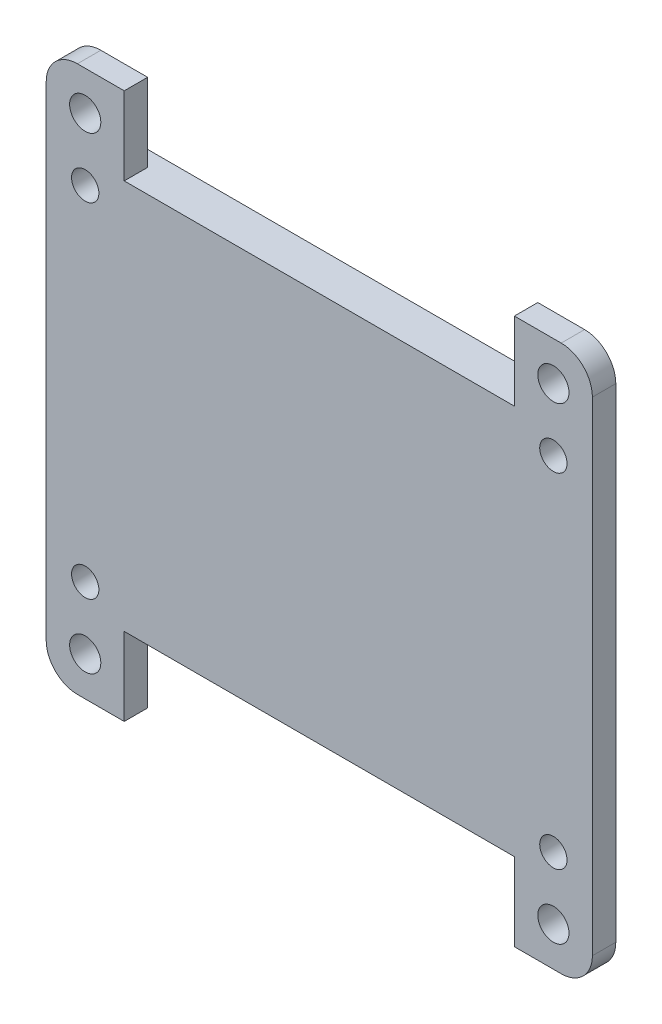
ISO-10303-21;
HEADER;
FILE_DESCRIPTION(('STEP AP214'),'2;1');
FILE_NAME('part.step','',(''),(''),'','','');
FILE_SCHEMA(('AUTOMOTIVE_DESIGN { 1 0 10303 214 1 1 1 1 }'));
ENDSEC;
DATA;
#1=APPLICATION_CONTEXT('core data for automotive mechanical design processes');
#2=APPLICATION_PROTOCOL_DEFINITION('international standard','automotive_design',2000,#1);
#3=PRODUCT_CONTEXT('',#1,'mechanical');
#4=PRODUCT('Part','Part','',(#3));
#5=PRODUCT_RELATED_PRODUCT_CATEGORY('part','',(#4));
#6=PRODUCT_DEFINITION_FORMATION('','',#4);
#7=PRODUCT_DEFINITION_CONTEXT('part definition',#1,'design');
#8=PRODUCT_DEFINITION('design','',#6,#7);
#9=PRODUCT_DEFINITION_SHAPE('','',#8);
#10=(LENGTH_UNIT() NAMED_UNIT(*) SI_UNIT(.MILLI.,.METRE.));
#11=(NAMED_UNIT(*) PLANE_ANGLE_UNIT() SI_UNIT($,.RADIAN.));
#12=(NAMED_UNIT(*) SI_UNIT($,.STERADIAN.) SOLID_ANGLE_UNIT());
#13=UNCERTAINTY_MEASURE_WITH_UNIT(LENGTH_MEASURE(1.E-05),#10,'distance_accuracy_value','');
#14=(GEOMETRIC_REPRESENTATION_CONTEXT(3) GLOBAL_UNCERTAINTY_ASSIGNED_CONTEXT((#13)) GLOBAL_UNIT_ASSIGNED_CONTEXT((#10,
#11,#12)) REPRESENTATION_CONTEXT('',''));
#15=CARTESIAN_POINT('',(0.,0.,0.));
#16=DIRECTION('',(0.,0.,1.));
#17=DIRECTION('',(1.,0.,0.));
#18=AXIS2_PLACEMENT_3D('',#15,#16,#17);
#19=CARTESIAN_POINT('',(0.,0.,0.));
#20=DIRECTION('',(0.,0.,-1.));
#21=DIRECTION('',(-1.,0.,0.));
#22=AXIS2_PLACEMENT_3D('',#19,#20,#21);
#23=PLANE('',#22);
#24=CARTESIAN_POINT('',(30.,-22.,0.));
#25=DIRECTION('',(0.,0.,1.));
#26=DIRECTION('',(-1.,0.,0.));
#27=AXIS2_PLACEMENT_3D('',#24,#25,#26);
#28=CIRCLE('',#27,1.75);
#29=CARTESIAN_POINT('',(28.25,-22.,0.));
#30=VERTEX_POINT('',#29);
#31=EDGE_CURVE('E376',#30,#30,#28,.T.);
#32=ORIENTED_EDGE('',*,*,#31,.T.);
#33=EDGE_LOOP('',(#32));
#34=FACE_BOUND('',#33,.T.);
#35=CARTESIAN_POINT('',(-30.,22.,0.));
#36=DIRECTION('',(0.,0.,1.));
#37=DIRECTION('',(1.,0.,0.));
#38=AXIS2_PLACEMENT_3D('',#35,#36,#37);
#39=CIRCLE('',#38,1.75);
#40=CARTESIAN_POINT('',(-28.25,22.,0.));
#41=VERTEX_POINT('',#40);
#42=EDGE_CURVE('E384',#41,#41,#39,.T.);
#43=ORIENTED_EDGE('',*,*,#42,.T.);
#44=EDGE_LOOP('',(#43));
#45=FACE_BOUND('',#44,.T.);
#46=DIRECTION('',(1.,0.,0.));
#47=VECTOR('',#46,1.);
#48=CARTESIAN_POINT('',(-33.,-25.,0.));
#49=LINE('',#48,#47);
#50=CARTESIAN_POINT('',(-30.,-25.,0.));
#51=VERTEX_POINT('',#50);
#52=CARTESIAN_POINT('',(30.,-25.,0.));
#53=VERTEX_POINT('',#52);
#54=EDGE_CURVE('E394',#51,#53,#49,.T.);
#55=ORIENTED_EDGE('',*,*,#54,.F.);
#56=CARTESIAN_POINT('',(-30.,-22.,0.));
#57=DIRECTION('',(0.,0.,-1.));
#58=DIRECTION('',(-1.,0.,0.));
#59=AXIS2_PLACEMENT_3D('',#56,#57,#58);
#60=CIRCLE('',#59,3.);
#61=CARTESIAN_POINT('',(-33.,-22.,0.));
#62=VERTEX_POINT('',#61);
#63=EDGE_CURVE('E436',#51,#62,#60,.T.);
#64=ORIENTED_EDGE('',*,*,#63,.T.);
#65=DIRECTION('',(0.,-1.,0.));
#66=VECTOR('',#65,1.);
#67=CARTESIAN_POINT('',(-33.,-25.,0.));
#68=LINE('',#67,#66);
#69=CARTESIAN_POINT('',(-33.,22.,0.));
#70=VERTEX_POINT('',#69);
#71=EDGE_CURVE('E414',#70,#62,#68,.T.);
#72=ORIENTED_EDGE('',*,*,#71,.F.);
#73=CARTESIAN_POINT('',(-30.,22.,0.));
#74=DIRECTION('',(0.,0.,-1.));
#75=DIRECTION('',(-1.,0.,0.));
#76=AXIS2_PLACEMENT_3D('',#73,#74,#75);
#77=CIRCLE('',#76,3.);
#78=CARTESIAN_POINT('',(-30.,25.,0.));
#79=VERTEX_POINT('',#78);
#80=EDGE_CURVE('E427',#70,#79,#77,.T.);
#81=ORIENTED_EDGE('',*,*,#80,.T.);
#82=DIRECTION('',(-1.,0.,0.));
#83=VECTOR('',#82,1.);
#84=CARTESIAN_POINT('',(-33.,25.,0.));
#85=LINE('',#84,#83);
#86=CARTESIAN_POINT('',(30.,25.,0.));
#87=VERTEX_POINT('',#86);
#88=EDGE_CURVE('E410',#87,#79,#85,.T.);
#89=ORIENTED_EDGE('',*,*,#88,.F.);
#90=CARTESIAN_POINT('',(30.,22.,0.));
#91=DIRECTION('',(0.,0.,-1.));
#92=DIRECTION('',(-1.,0.,0.));
#93=AXIS2_PLACEMENT_3D('',#90,#91,#92);
#94=CIRCLE('',#93,3.);
#95=CARTESIAN_POINT('',(33.,22.,0.));
#96=VERTEX_POINT('',#95);
#97=EDGE_CURVE('E430',#87,#96,#94,.T.);
#98=ORIENTED_EDGE('',*,*,#97,.T.);
#99=DIRECTION('',(0.,1.,0.));
#100=VECTOR('',#99,1.);
#101=CARTESIAN_POINT('',(33.,-25.,0.));
#102=LINE('',#101,#100);
#103=CARTESIAN_POINT('',(33.,-22.,0.));
#104=VERTEX_POINT('',#103);
#105=EDGE_CURVE('E388',#104,#96,#102,.T.);
#106=ORIENTED_EDGE('',*,*,#105,.F.);
#107=CARTESIAN_POINT('',(30.,-22.,0.));
#108=DIRECTION('',(0.,0.,-1.));
#109=DIRECTION('',(-1.,0.,0.));
#110=AXIS2_PLACEMENT_3D('',#107,#108,#109);
#111=CIRCLE('',#110,3.);
#112=EDGE_CURVE('E433',#104,#53,#111,.T.);
#113=ORIENTED_EDGE('',*,*,#112,.T.);
#114=EDGE_LOOP('',(#55,#64,#72,#81,#89,#98,#106,#113));
#115=FACE_BOUND('',#114,.T.);
#116=CARTESIAN_POINT('',(30.,22.,0.));
#117=DIRECTION('',(0.,0.,1.));
#118=DIRECTION('',(1.,0.,0.));
#119=AXIS2_PLACEMENT_3D('',#116,#117,#118);
#120=CIRCLE('',#119,1.75);
#121=CARTESIAN_POINT('',(31.75,22.,0.));
#122=VERTEX_POINT('',#121);
#123=EDGE_CURVE('E380',#122,#122,#120,.T.);
#124=ORIENTED_EDGE('',*,*,#123,.T.);
#125=EDGE_LOOP('',(#124));
#126=FACE_BOUND('',#125,.T.);
#127=CARTESIAN_POINT('',(-30.,-22.,0.));
#128=DIRECTION('',(0.,0.,1.));
#129=DIRECTION('',(-1.,0.,0.));
#130=AXIS2_PLACEMENT_3D('',#127,#128,#129);
#131=CIRCLE('',#130,1.75);
#132=CARTESIAN_POINT('',(-31.75,-22.,0.));
#133=VERTEX_POINT('',#132);
#134=EDGE_CURVE('E214',#133,#133,#131,.T.);
#135=ORIENTED_EDGE('',*,*,#134,.T.);
#136=EDGE_LOOP('',(#135));
#137=FACE_BOUND('',#136,.T.);
#138=ADVANCED_FACE('F41',(#34,#45,#115,#126,#137),#23,.T.);
#139=CARTESIAN_POINT('',(33.,-25.,2.));
#140=DIRECTION('',(-1.,0.,0.));
#141=DIRECTION('',(0.,0.,1.));
#142=AXIS2_PLACEMENT_3D('',#139,#140,#141);
#143=PLANE('',#142);
#144=DIRECTION('',(0.,1.,0.));
#145=VECTOR('',#144,1.);
#146=CARTESIAN_POINT('',(33.,-25.,2.));
#147=LINE('',#146,#145);
#148=CARTESIAN_POINT('',(33.,-22.,2.));
#149=VERTEX_POINT('',#148);
#150=CARTESIAN_POINT('',(33.,22.,2.));
#151=VERTEX_POINT('',#150);
#152=EDGE_CURVE('E389',#149,#151,#147,.T.);
#153=ORIENTED_EDGE('',*,*,#152,.F.);
#154=DIRECTION('',(0.,0.,-1.));
#155=VECTOR('',#154,1.);
#156=CARTESIAN_POINT('',(33.,-22.,2.));
#157=LINE('',#156,#155);
#158=EDGE_CURVE('E465',#149,#104,#157,.T.);
#159=ORIENTED_EDGE('',*,*,#158,.T.);
#160=ORIENTED_EDGE('',*,*,#105,.T.);
#161=DIRECTION('',(0.,0.,-1.));
#162=VECTOR('',#161,1.);
#163=CARTESIAN_POINT('',(33.,22.,2.));
#164=LINE('',#163,#162);
#165=EDGE_CURVE('E462',#96,#151,#164,.F.);
#166=ORIENTED_EDGE('',*,*,#165,.T.);
#167=EDGE_LOOP('',(#153,#159,#160,#166));
#168=FACE_BOUND('',#167,.T.);
#169=ADVANCED_FACE('F572',(#168),#143,.F.);
#170=CARTESIAN_POINT('',(-33.,25.,2.));
#171=DIRECTION('',(0.,-1.,0.));
#172=DIRECTION('',(0.,0.,-1.));
#173=AXIS2_PLACEMENT_3D('',#170,#171,#172);
#174=PLANE('',#173);
#175=DIRECTION('',(-1.,0.,0.));
#176=VECTOR('',#175,1.);
#177=CARTESIAN_POINT('',(-33.,25.,2.));
#178=LINE('',#177,#176);
#179=CARTESIAN_POINT('',(30.,25.,2.));
#180=VERTEX_POINT('',#179);
#181=CARTESIAN_POINT('',(25.,25.,2.));
#182=VERTEX_POINT('',#181);
#183=EDGE_CURVE('E395',#180,#182,#178,.T.);
#184=ORIENTED_EDGE('',*,*,#183,.F.);
#185=DIRECTION('',(0.,0.,-1.));
#186=VECTOR('',#185,1.);
#187=CARTESIAN_POINT('',(30.,25.,2.));
#188=LINE('',#187,#186);
#189=EDGE_CURVE('E472',#180,#87,#188,.T.);
#190=ORIENTED_EDGE('',*,*,#189,.T.);
#191=ORIENTED_EDGE('',*,*,#88,.T.);
#192=DIRECTION('',(0.,0.,-1.));
#193=VECTOR('',#192,1.);
#194=CARTESIAN_POINT('',(-30.,25.,2.));
#195=LINE('',#194,#193);
#196=CARTESIAN_POINT('',(-30.,25.,2.));
#197=VERTEX_POINT('',#196);
#198=EDGE_CURVE('E469',#79,#197,#195,.F.);
#199=ORIENTED_EDGE('',*,*,#198,.T.);
#200=CARTESIAN_POINT('',(-25.,25.,2.));
#201=VERTEX_POINT('',#200);
#202=EDGE_CURVE('E393',#201,#197,#178,.T.);
#203=ORIENTED_EDGE('',*,*,#202,.F.);
#204=DIRECTION('',(0.,0.,-1.));
#205=VECTOR('',#204,1.);
#206=CARTESIAN_POINT('',(-25.,25.,5.));
#207=LINE('',#206,#205);
#208=CARTESIAN_POINT('',(-25.,25.,5.));
#209=VERTEX_POINT('',#208);
#210=EDGE_CURVE('E356',#209,#201,#207,.T.);
#211=ORIENTED_EDGE('',*,*,#210,.F.);
#212=DIRECTION('',(-1.,0.,0.));
#213=VECTOR('',#212,1.);
#214=CARTESIAN_POINT('',(0.,25.,5.));
#215=LINE('',#214,#213);
#216=CARTESIAN_POINT('',(25.,25.,5.));
#217=VERTEX_POINT('',#216);
#218=EDGE_CURVE('E256',#217,#209,#215,.T.);
#219=ORIENTED_EDGE('',*,*,#218,.F.);
#220=DIRECTION('',(0.,0.,-1.));
#221=VECTOR('',#220,1.);
#222=CARTESIAN_POINT('',(25.,25.,5.));
#223=LINE('',#222,#221);
#224=EDGE_CURVE('E360',#217,#182,#223,.T.);
#225=ORIENTED_EDGE('',*,*,#224,.T.);
#226=EDGE_LOOP('',(#184,#190,#191,#199,#203,#211,#219,#225));
#227=FACE_BOUND('',#226,.T.);
#228=ADVANCED_FACE('F558',(#227),#174,.F.);
#229=CARTESIAN_POINT('',(-33.,-25.,2.));
#230=DIRECTION('',(1.,0.,0.));
#231=DIRECTION('',(0.,0.,-1.));
#232=AXIS2_PLACEMENT_3D('',#229,#230,#231);
#233=PLANE('',#232);
#234=ORIENTED_EDGE('',*,*,#71,.T.);
#235=DIRECTION('',(0.,0.,-1.));
#236=VECTOR('',#235,1.);
#237=CARTESIAN_POINT('',(-33.,-22.,2.));
#238=LINE('',#237,#236);
#239=CARTESIAN_POINT('',(-33.,-22.,2.));
#240=VERTEX_POINT('',#239);
#241=EDGE_CURVE('E443',#62,#240,#238,.F.);
#242=ORIENTED_EDGE('',*,*,#241,.T.);
#243=DIRECTION('',(0.,-1.,0.));
#244=VECTOR('',#243,1.);
#245=CARTESIAN_POINT('',(-33.,-25.,2.));
#246=LINE('',#245,#244);
#247=CARTESIAN_POINT('',(-33.,22.,2.));
#248=VERTEX_POINT('',#247);
#249=EDGE_CURVE('E398',#248,#240,#246,.T.);
#250=ORIENTED_EDGE('',*,*,#249,.F.);
#251=DIRECTION('',(0.,0.,-1.));
#252=VECTOR('',#251,1.);
#253=CARTESIAN_POINT('',(-33.,22.,2.));
#254=LINE('',#253,#252);
#255=EDGE_CURVE('E439',#248,#70,#254,.T.);
#256=ORIENTED_EDGE('',*,*,#255,.T.);
#257=EDGE_LOOP('',(#234,#242,#250,#256));
#258=FACE_BOUND('',#257,.T.);
#259=ADVANCED_FACE('F549',(#258),#233,.F.);
#260=CARTESIAN_POINT('',(-33.,-25.,2.));
#261=DIRECTION('',(0.,1.,0.));
#262=DIRECTION('',(0.,0.,1.));
#263=AXIS2_PLACEMENT_3D('',#260,#261,#262);
#264=PLANE('',#263);
#265=DIRECTION('',(1.,0.,0.));
#266=VECTOR('',#265,1.);
#267=CARTESIAN_POINT('',(-33.,-25.,2.));
#268=LINE('',#267,#266);
#269=CARTESIAN_POINT('',(-30.,-25.,2.));
#270=VERTEX_POINT('',#269);
#271=CARTESIAN_POINT('',(-25.,-25.,2.));
#272=VERTEX_POINT('',#271);
#273=EDGE_CURVE('E403',#270,#272,#268,.T.);
#274=ORIENTED_EDGE('',*,*,#273,.F.);
#275=DIRECTION('',(0.,0.,-1.));
#276=VECTOR('',#275,1.);
#277=CARTESIAN_POINT('',(-30.,-25.,2.));
#278=LINE('',#277,#276);
#279=EDGE_CURVE('E423',#270,#51,#278,.T.);
#280=ORIENTED_EDGE('',*,*,#279,.T.);
#281=ORIENTED_EDGE('',*,*,#54,.T.);
#282=DIRECTION('',(0.,0.,-1.));
#283=VECTOR('',#282,1.);
#284=CARTESIAN_POINT('',(30.,-25.,2.));
#285=LINE('',#284,#283);
#286=CARTESIAN_POINT('',(30.,-25.,2.));
#287=VERTEX_POINT('',#286);
#288=EDGE_CURVE('E406',#53,#287,#285,.F.);
#289=ORIENTED_EDGE('',*,*,#288,.T.);
#290=CARTESIAN_POINT('',(25.,-25.,2.));
#291=VERTEX_POINT('',#290);
#292=EDGE_CURVE('E402',#291,#287,#268,.T.);
#293=ORIENTED_EDGE('',*,*,#292,.F.);
#294=DIRECTION('',(0.,0.,-1.));
#295=VECTOR('',#294,1.);
#296=CARTESIAN_POINT('',(25.,-25.,5.));
#297=LINE('',#296,#295);
#298=CARTESIAN_POINT('',(25.,-25.,5.));
#299=VERTEX_POINT('',#298);
#300=EDGE_CURVE('E215',#299,#291,#297,.T.);
#301=ORIENTED_EDGE('',*,*,#300,.F.);
#302=DIRECTION('',(1.,0.,0.));
#303=VECTOR('',#302,1.);
#304=CARTESIAN_POINT('',(0.,-25.,5.));
#305=LINE('',#304,#303);
#306=CARTESIAN_POINT('',(-25.,-25.,5.));
#307=VERTEX_POINT('',#306);
#308=EDGE_CURVE('E218',#307,#299,#305,.T.);
#309=ORIENTED_EDGE('',*,*,#308,.F.);
#310=DIRECTION('',(0.,0.,-1.));
#311=VECTOR('',#310,1.);
#312=CARTESIAN_POINT('',(-25.,-25.,5.));
#313=LINE('',#312,#311);
#314=EDGE_CURVE('E204',#307,#272,#313,.T.);
#315=ORIENTED_EDGE('',*,*,#314,.T.);
#316=EDGE_LOOP('',(#274,#280,#281,#289,#293,#301,#309,#315));
#317=FACE_BOUND('',#316,.T.);
#318=ADVANCED_FACE('F219',(#317),#264,.F.);
#319=CARTESIAN_POINT('',(-30.,22.,2.));
#320=DIRECTION('',(0.,0.,-1.));
#321=DIRECTION('',(-1.,0.,0.));
#322=AXIS2_PLACEMENT_3D('',#319,#320,#321);
#323=CYLINDRICAL_SURFACE('',#322,1.75);
#324=ORIENTED_EDGE('',*,*,#42,.F.);
#325=EDGE_LOOP('',(#324));
#326=FACE_BOUND('',#325,.T.);
#327=CARTESIAN_POINT('',(-30.,22.,5.));
#328=DIRECTION('',(0.,0.,1.));
#329=DIRECTION('',(1.,0.,0.));
#330=AXIS2_PLACEMENT_3D('',#327,#328,#329);
#331=CIRCLE('',#330,1.75);
#332=CARTESIAN_POINT('',(-28.25,22.,5.));
#333=VERTEX_POINT('',#332);
#334=EDGE_CURVE('E272',#333,#333,#331,.F.);
#335=ORIENTED_EDGE('',*,*,#334,.F.);
#336=EDGE_LOOP('',(#335));
#337=FACE_BOUND('',#336,.T.);
#338=ADVANCED_FACE('F631',(#326,#337),#323,.F.);
#339=CARTESIAN_POINT('',(30.,22.,2.));
#340=DIRECTION('',(0.,0.,-1.));
#341=DIRECTION('',(-1.,0.,0.));
#342=AXIS2_PLACEMENT_3D('',#339,#340,#341);
#343=CYLINDRICAL_SURFACE('',#342,1.75);
#344=ORIENTED_EDGE('',*,*,#123,.F.);
#345=EDGE_LOOP('',(#344));
#346=FACE_BOUND('',#345,.T.);
#347=CARTESIAN_POINT('',(30.,22.,5.));
#348=DIRECTION('',(0.,0.,1.));
#349=DIRECTION('',(1.,0.,0.));
#350=AXIS2_PLACEMENT_3D('',#347,#348,#349);
#351=CIRCLE('',#350,1.75);
#352=CARTESIAN_POINT('',(31.75,22.,5.));
#353=VERTEX_POINT('',#352);
#354=EDGE_CURVE('E284',#353,#353,#351,.F.);
#355=ORIENTED_EDGE('',*,*,#354,.F.);
#356=EDGE_LOOP('',(#355));
#357=FACE_BOUND('',#356,.T.);
#358=ADVANCED_FACE('F853',(#346,#357),#343,.F.);
#359=CARTESIAN_POINT('',(30.,-22.,2.));
#360=DIRECTION('',(0.,0.,-1.));
#361=DIRECTION('',(-1.,0.,0.));
#362=AXIS2_PLACEMENT_3D('',#359,#360,#361);
#363=CYLINDRICAL_SURFACE('',#362,1.75);
#364=ORIENTED_EDGE('',*,*,#31,.F.);
#365=EDGE_LOOP('',(#364));
#366=FACE_BOUND('',#365,.T.);
#367=CARTESIAN_POINT('',(30.,-22.,5.));
#368=DIRECTION('',(0.,0.,1.));
#369=DIRECTION('',(1.,0.,0.));
#370=AXIS2_PLACEMENT_3D('',#367,#368,#369);
#371=CIRCLE('',#370,1.75);
#372=CARTESIAN_POINT('',(31.75,-22.,5.));
#373=VERTEX_POINT('',#372);
#374=EDGE_CURVE('E276',#373,#373,#371,.F.);
#375=ORIENTED_EDGE('',*,*,#374,.F.);
#376=EDGE_LOOP('',(#375));
#377=FACE_BOUND('',#376,.T.);
#378=ADVANCED_FACE('F841',(#366,#377),#363,.F.);
#379=CARTESIAN_POINT('',(-30.,-22.,2.));
#380=DIRECTION('',(0.,0.,-1.));
#381=DIRECTION('',(-1.,0.,0.));
#382=AXIS2_PLACEMENT_3D('',#379,#380,#381);
#383=CYLINDRICAL_SURFACE('',#382,1.75);
#384=ORIENTED_EDGE('',*,*,#134,.F.);
#385=EDGE_LOOP('',(#384));
#386=FACE_BOUND('',#385,.T.);
#387=CARTESIAN_POINT('',(-30.,-22.,5.));
#388=DIRECTION('',(0.,0.,1.));
#389=DIRECTION('',(1.,0.,0.));
#390=AXIS2_PLACEMENT_3D('',#387,#388,#389);
#391=CIRCLE('',#390,1.75);
#392=CARTESIAN_POINT('',(-28.25,-22.,5.));
#393=VERTEX_POINT('',#392);
#394=EDGE_CURVE('E280',#393,#393,#391,.F.);
#395=ORIENTED_EDGE('',*,*,#394,.F.);
#396=EDGE_LOOP('',(#395));
#397=FACE_BOUND('',#396,.T.);
#398=ADVANCED_FACE('F641',(#386,#397),#383,.F.);
#399=CARTESIAN_POINT('',(-30.,-22.,2.));
#400=DIRECTION('',(0.,0.,-1.));
#401=DIRECTION('',(-1.,0.,0.));
#402=AXIS2_PLACEMENT_3D('',#399,#400,#401);
#403=CYLINDRICAL_SURFACE('',#402,3.);
#404=CARTESIAN_POINT('',(-30.,-22.,2.));
#405=DIRECTION('',(0.,0.,-1.));
#406=DIRECTION('',(-1.,0.,0.));
#407=AXIS2_PLACEMENT_3D('',#404,#405,#406);
#408=CIRCLE('',#407,3.);
#409=EDGE_CURVE('E458',#240,#270,#408,.F.);
#410=ORIENTED_EDGE('',*,*,#409,.F.);
#411=ORIENTED_EDGE('',*,*,#241,.F.);
#412=ORIENTED_EDGE('',*,*,#63,.F.);
#413=ORIENTED_EDGE('',*,*,#279,.F.);
#414=EDGE_LOOP('',(#410,#411,#412,#413));
#415=FACE_BOUND('',#414,.T.);
#416=ADVANCED_FACE('F543',(#415),#403,.T.);
#417=CARTESIAN_POINT('',(30.,-22.,2.));
#418=DIRECTION('',(0.,0.,-1.));
#419=DIRECTION('',(-1.,0.,0.));
#420=AXIS2_PLACEMENT_3D('',#417,#418,#419);
#421=CYLINDRICAL_SURFACE('',#420,3.);
#422=CARTESIAN_POINT('',(30.,-22.,2.));
#423=DIRECTION('',(0.,0.,-1.));
#424=DIRECTION('',(-1.,0.,0.));
#425=AXIS2_PLACEMENT_3D('',#422,#423,#424);
#426=CIRCLE('',#425,3.);
#427=EDGE_CURVE('E454',#287,#149,#426,.F.);
#428=ORIENTED_EDGE('',*,*,#427,.F.);
#429=ORIENTED_EDGE('',*,*,#288,.F.);
#430=ORIENTED_EDGE('',*,*,#112,.F.);
#431=ORIENTED_EDGE('',*,*,#158,.F.);
#432=EDGE_LOOP('',(#428,#429,#430,#431));
#433=FACE_BOUND('',#432,.T.);
#434=ADVANCED_FACE('F575',(#433),#421,.T.);
#435=CARTESIAN_POINT('',(30.,22.,2.));
#436=DIRECTION('',(0.,0.,-1.));
#437=DIRECTION('',(-1.,0.,0.));
#438=AXIS2_PLACEMENT_3D('',#435,#436,#437);
#439=CYLINDRICAL_SURFACE('',#438,3.);
#440=CARTESIAN_POINT('',(30.,22.,2.));
#441=DIRECTION('',(0.,0.,-1.));
#442=DIRECTION('',(-1.,0.,0.));
#443=AXIS2_PLACEMENT_3D('',#440,#441,#442);
#444=CIRCLE('',#443,3.);
#445=EDGE_CURVE('E450',#151,#180,#444,.F.);
#446=ORIENTED_EDGE('',*,*,#445,.F.);
#447=ORIENTED_EDGE('',*,*,#165,.F.);
#448=ORIENTED_EDGE('',*,*,#97,.F.);
#449=ORIENTED_EDGE('',*,*,#189,.F.);
#450=EDGE_LOOP('',(#446,#447,#448,#449));
#451=FACE_BOUND('',#450,.T.);
#452=ADVANCED_FACE('F562',(#451),#439,.T.);
#453=CARTESIAN_POINT('',(-30.,22.,2.));
#454=DIRECTION('',(0.,0.,-1.));
#455=DIRECTION('',(-1.,0.,0.));
#456=AXIS2_PLACEMENT_3D('',#453,#454,#455);
#457=CYLINDRICAL_SURFACE('',#456,3.);
#458=CARTESIAN_POINT('',(-30.,22.,2.));
#459=DIRECTION('',(0.,0.,-1.));
#460=DIRECTION('',(-1.,0.,0.));
#461=AXIS2_PLACEMENT_3D('',#458,#459,#460);
#462=CIRCLE('',#461,3.);
#463=EDGE_CURVE('E446',#197,#248,#462,.F.);
#464=ORIENTED_EDGE('',*,*,#463,.F.);
#465=ORIENTED_EDGE('',*,*,#198,.F.);
#466=ORIENTED_EDGE('',*,*,#80,.F.);
#467=ORIENTED_EDGE('',*,*,#255,.F.);
#468=EDGE_LOOP('',(#464,#465,#466,#467));
#469=FACE_BOUND('',#468,.T.);
#470=ADVANCED_FACE('F553',(#469),#457,.T.);
#471=CARTESIAN_POINT('',(0.,0.,2.));
#472=DIRECTION('',(0.,0.,1.));
#473=DIRECTION('',(1.,0.,0.));
#474=AXIS2_PLACEMENT_3D('',#471,#472,#473);
#475=PLANE('',#474);
#476=CARTESIAN_POINT('',(29.9999999999999,-30.,2.));
#477=DIRECTION('',(0.,0.,1.));
#478=DIRECTION('',(1.,0.,0.));
#479=AXIS2_PLACEMENT_3D('',#476,#477,#478);
#480=CIRCLE('',#479,2.);
#481=CARTESIAN_POINT('',(31.9999999999999,-30.,2.));
#482=VERTEX_POINT('',#481);
#483=EDGE_CURVE('E233',#482,#482,#480,.F.);
#484=ORIENTED_EDGE('',*,*,#483,.F.);
#485=EDGE_LOOP('',(#484));
#486=FACE_BOUND('',#485,.T.);
#487=CARTESIAN_POINT('',(30.,30.,2.));
#488=DIRECTION('',(0.,0.,1.));
#489=DIRECTION('',(1.,0.,0.));
#490=AXIS2_PLACEMENT_3D('',#487,#488,#489);
#491=CIRCLE('',#490,2.);
#492=CARTESIAN_POINT('',(32.,30.,2.));
#493=VERTEX_POINT('',#492);
#494=EDGE_CURVE('E237',#493,#493,#491,.T.);
#495=ORIENTED_EDGE('',*,*,#494,.T.);
#496=EDGE_LOOP('',(#495));
#497=FACE_BOUND('',#496,.T.);
#498=DIRECTION('',(0.,1.,0.));
#499=VECTOR('',#498,1.);
#500=CARTESIAN_POINT('',(35.,0.,2.));
#501=LINE('',#500,#499);
#502=CARTESIAN_POINT('',(35.,-31.,2.));
#503=VERTEX_POINT('',#502);
#504=CARTESIAN_POINT('',(35.,31.,2.));
#505=VERTEX_POINT('',#504);
#506=EDGE_CURVE('E314',#503,#505,#501,.T.);
#507=ORIENTED_EDGE('',*,*,#506,.F.);
#508=CARTESIAN_POINT('',(31.,-31.,2.));
#509=DIRECTION('',(0.,0.,1.));
#510=DIRECTION('',(1.,0.,0.));
#511=AXIS2_PLACEMENT_3D('',#508,#509,#510);
#512=CIRCLE('',#511,4.);
#513=CARTESIAN_POINT('',(31.,-35.,2.));
#514=VERTEX_POINT('',#513);
#515=EDGE_CURVE('E486',#503,#514,#512,.F.);
#516=ORIENTED_EDGE('',*,*,#515,.T.);
#517=DIRECTION('',(1.,0.,0.));
#518=VECTOR('',#517,1.);
#519=CARTESIAN_POINT('',(0.,-35.,2.));
#520=LINE('',#519,#518);
#521=CARTESIAN_POINT('',(25.,-35.,2.));
#522=VERTEX_POINT('',#521);
#523=EDGE_CURVE('E310',#522,#514,#520,.T.);
#524=ORIENTED_EDGE('',*,*,#523,.F.);
#525=DIRECTION('',(0.,-1.,0.));
#526=VECTOR('',#525,1.);
#527=CARTESIAN_POINT('',(25.,0.,2.));
#528=LINE('',#527,#526);
#529=EDGE_CURVE('E307',#291,#522,#528,.T.);
#530=ORIENTED_EDGE('',*,*,#529,.F.);
#531=ORIENTED_EDGE('',*,*,#292,.T.);
#532=ORIENTED_EDGE('',*,*,#427,.T.);
#533=ORIENTED_EDGE('',*,*,#152,.T.);
#534=ORIENTED_EDGE('',*,*,#445,.T.);
#535=ORIENTED_EDGE('',*,*,#183,.T.);
#536=DIRECTION('',(0.,-1.,0.));
#537=VECTOR('',#536,1.);
#538=CARTESIAN_POINT('',(25.,0.,2.));
#539=LINE('',#538,#537);
#540=CARTESIAN_POINT('',(25.,35.,2.));
#541=VERTEX_POINT('',#540);
#542=EDGE_CURVE('E322',#541,#182,#539,.T.);
#543=ORIENTED_EDGE('',*,*,#542,.F.);
#544=DIRECTION('',(1.,0.,0.));
#545=VECTOR('',#544,1.);
#546=CARTESIAN_POINT('',(0.,35.,2.));
#547=LINE('',#546,#545);
#548=CARTESIAN_POINT('',(31.,35.,2.));
#549=VERTEX_POINT('',#548);
#550=EDGE_CURVE('E318',#541,#549,#547,.T.);
#551=ORIENTED_EDGE('',*,*,#550,.T.);
#552=CARTESIAN_POINT('',(31.,31.,2.));
#553=DIRECTION('',(0.,0.,1.));
#554=DIRECTION('',(1.,0.,0.));
#555=AXIS2_PLACEMENT_3D('',#552,#553,#554);
#556=CIRCLE('',#555,4.);
#557=EDGE_CURVE('E483',#549,#505,#556,.F.);
#558=ORIENTED_EDGE('',*,*,#557,.T.);
#559=EDGE_LOOP('',(#507,#516,#524,#530,#531,#532,#533,#534,#535,#543,#551,#558));
#560=FACE_BOUND('',#559,.T.);
#561=ADVANCED_FACE('F566',(#486,#497,#560),#475,.F.);
#562=CARTESIAN_POINT('',(-30.,-30.,2.));
#563=DIRECTION('',(0.,0.,1.));
#564=DIRECTION('',(1.,0.,0.));
#565=AXIS2_PLACEMENT_3D('',#562,#563,#564);
#566=CIRCLE('',#565,2.);
#567=CARTESIAN_POINT('',(-28.,-30.,2.));
#568=VERTEX_POINT('',#567);
#569=EDGE_CURVE('E343',#568,#568,#566,.F.);
#570=ORIENTED_EDGE('',*,*,#569,.F.);
#571=EDGE_LOOP('',(#570));
#572=FACE_BOUND('',#571,.T.);
#573=CARTESIAN_POINT('',(-30.,30.,2.));
#574=DIRECTION('',(0.,0.,1.));
#575=DIRECTION('',(1.,0.,0.));
#576=AXIS2_PLACEMENT_3D('',#573,#574,#575);
#577=CIRCLE('',#576,2.);
#578=CARTESIAN_POINT('',(-28.,30.,2.));
#579=VERTEX_POINT('',#578);
#580=EDGE_CURVE('E339',#579,#579,#577,.T.);
#581=ORIENTED_EDGE('',*,*,#580,.T.);
#582=EDGE_LOOP('',(#581));
#583=FACE_BOUND('',#582,.T.);
#584=DIRECTION('',(1.,0.,0.));
#585=VECTOR('',#584,1.);
#586=CARTESIAN_POINT('',(0.,-35.,2.));
#587=LINE('',#586,#585);
#588=CARTESIAN_POINT('',(-31.,-35.,2.));
#589=VERTEX_POINT('',#588);
#590=CARTESIAN_POINT('',(-25.,-35.,2.));
#591=VERTEX_POINT('',#590);
#592=EDGE_CURVE('E336',#589,#591,#587,.T.);
#593=ORIENTED_EDGE('',*,*,#592,.F.);
#594=CARTESIAN_POINT('',(-31.,-31.,2.));
#595=DIRECTION('',(0.,0.,1.));
#596=DIRECTION('',(1.,0.,0.));
#597=AXIS2_PLACEMENT_3D('',#594,#595,#596);
#598=CIRCLE('',#597,4.);
#599=CARTESIAN_POINT('',(-35.,-31.,2.));
#600=VERTEX_POINT('',#599);
#601=EDGE_CURVE('E510',#589,#600,#598,.F.);
#602=ORIENTED_EDGE('',*,*,#601,.T.);
#603=DIRECTION('',(0.,1.,0.));
#604=VECTOR('',#603,1.);
#605=CARTESIAN_POINT('',(-35.,0.,2.));
#606=LINE('',#605,#604);
#607=CARTESIAN_POINT('',(-35.,31.,2.));
#608=VERTEX_POINT('',#607);
#609=EDGE_CURVE('E333',#600,#608,#606,.T.);
#610=ORIENTED_EDGE('',*,*,#609,.T.);
#611=CARTESIAN_POINT('',(-31.,31.,2.));
#612=DIRECTION('',(0.,0.,1.));
#613=DIRECTION('',(1.,0.,0.));
#614=AXIS2_PLACEMENT_3D('',#611,#612,#613);
#615=CIRCLE('',#614,4.);
#616=CARTESIAN_POINT('',(-31.,35.,2.));
#617=VERTEX_POINT('',#616);
#618=EDGE_CURVE('E57',#608,#617,#615,.F.);
#619=ORIENTED_EDGE('',*,*,#618,.T.);
#620=DIRECTION('',(1.,0.,0.));
#621=VECTOR('',#620,1.);
#622=CARTESIAN_POINT('',(0.,35.,2.));
#623=LINE('',#622,#621);
#624=CARTESIAN_POINT('',(-25.,35.,2.));
#625=VERTEX_POINT('',#624);
#626=EDGE_CURVE('E330',#617,#625,#623,.T.);
#627=ORIENTED_EDGE('',*,*,#626,.T.);
#628=DIRECTION('',(0.,-1.,0.));
#629=VECTOR('',#628,1.);
#630=CARTESIAN_POINT('',(-25.,0.,2.));
#631=LINE('',#630,#629);
#632=EDGE_CURVE('E326',#625,#201,#631,.T.);
#633=ORIENTED_EDGE('',*,*,#632,.T.);
#634=ORIENTED_EDGE('',*,*,#202,.T.);
#635=ORIENTED_EDGE('',*,*,#463,.T.);
#636=ORIENTED_EDGE('',*,*,#249,.T.);
#637=ORIENTED_EDGE('',*,*,#409,.T.);
#638=ORIENTED_EDGE('',*,*,#273,.T.);
#639=DIRECTION('',(0.,-1.,0.));
#640=VECTOR('',#639,1.);
#641=CARTESIAN_POINT('',(-25.,0.,2.));
#642=LINE('',#641,#640);
#643=EDGE_CURVE('E211',#272,#591,#642,.T.);
#644=ORIENTED_EDGE('',*,*,#643,.T.);
#645=EDGE_LOOP('',(#593,#602,#610,#619,#627,#633,#634,#635,#636,#637,#638,#644));
#646=FACE_BOUND('',#645,.T.);
#647=ADVANCED_FACE('F532',(#572,#583,#646),#475,.F.);
#648=CARTESIAN_POINT('',(-25.,0.,5.));
#649=DIRECTION('',(1.,0.,0.));
#650=DIRECTION('',(0.,0.,-1.));
#651=AXIS2_PLACEMENT_3D('',#648,#649,#650);
#652=PLANE('',#651);
#653=ORIENTED_EDGE('',*,*,#643,.F.);
#654=ORIENTED_EDGE('',*,*,#314,.F.);
#655=DIRECTION('',(0.,-1.,0.));
#656=VECTOR('',#655,1.);
#657=CARTESIAN_POINT('',(-25.,0.,5.));
#658=LINE('',#657,#656);
#659=CARTESIAN_POINT('',(-25.,-35.,5.));
#660=VERTEX_POINT('',#659);
#661=EDGE_CURVE('E209',#307,#660,#658,.T.);
#662=ORIENTED_EDGE('',*,*,#661,.T.);
#663=DIRECTION('',(0.,0.,-1.));
#664=VECTOR('',#663,1.);
#665=CARTESIAN_POINT('',(-25.,-35.,5.));
#666=LINE('',#665,#664);
#667=EDGE_CURVE('E304',#660,#591,#666,.T.);
#668=ORIENTED_EDGE('',*,*,#667,.T.);
#669=EDGE_LOOP('',(#653,#654,#662,#668));
#670=FACE_BOUND('',#669,.T.);
#671=ADVANCED_FACE('F206',(#670),#652,.T.);
#672=CARTESIAN_POINT('',(25.,0.,5.));
#673=DIRECTION('',(1.,0.,0.));
#674=DIRECTION('',(0.,0.,-1.));
#675=AXIS2_PLACEMENT_3D('',#672,#673,#674);
#676=PLANE('',#675);
#677=ORIENTED_EDGE('',*,*,#529,.T.);
#678=DIRECTION('',(0.,0.,-1.));
#679=VECTOR('',#678,1.);
#680=CARTESIAN_POINT('',(25.,-35.,5.));
#681=LINE('',#680,#679);
#682=CARTESIAN_POINT('',(25.,-35.,5.));
#683=VERTEX_POINT('',#682);
#684=EDGE_CURVE('E367',#683,#522,#681,.T.);
#685=ORIENTED_EDGE('',*,*,#684,.F.);
#686=DIRECTION('',(0.,-1.,0.));
#687=VECTOR('',#686,1.);
#688=CARTESIAN_POINT('',(25.,0.,5.));
#689=LINE('',#688,#687);
#690=EDGE_CURVE('E224',#299,#683,#689,.T.);
#691=ORIENTED_EDGE('',*,*,#690,.F.);
#692=ORIENTED_EDGE('',*,*,#300,.T.);
#693=EDGE_LOOP('',(#677,#685,#691,#692));
#694=FACE_BOUND('',#693,.T.);
#695=ADVANCED_FACE('F580',(#694),#676,.F.);
#696=CARTESIAN_POINT('',(0.,-35.,5.));
#697=DIRECTION('',(0.,1.,0.));
#698=DIRECTION('',(0.,0.,1.));
#699=AXIS2_PLACEMENT_3D('',#696,#697,#698);
#700=PLANE('',#699);
#701=ORIENTED_EDGE('',*,*,#523,.T.);
#702=DIRECTION('',(0.,0.,-1.));
#703=VECTOR('',#702,1.);
#704=CARTESIAN_POINT('',(31.,-35.,5.));
#705=LINE('',#704,#703);
#706=CARTESIAN_POINT('',(31.,-35.,5.));
#707=VERTEX_POINT('',#706);
#708=EDGE_CURVE('E489',#514,#707,#705,.F.);
#709=ORIENTED_EDGE('',*,*,#708,.T.);
#710=DIRECTION('',(1.,0.,0.));
#711=VECTOR('',#710,1.);
#712=CARTESIAN_POINT('',(0.,-35.,5.));
#713=LINE('',#712,#711);
#714=EDGE_CURVE('E242',#683,#707,#713,.T.);
#715=ORIENTED_EDGE('',*,*,#714,.F.);
#716=ORIENTED_EDGE('',*,*,#684,.T.);
#717=EDGE_LOOP('',(#701,#709,#715,#716));
#718=FACE_BOUND('',#717,.T.);
#719=ADVANCED_FACE('F585',(#718),#700,.F.);
#720=CARTESIAN_POINT('',(35.,0.,5.));
#721=DIRECTION('',(-1.,0.,0.));
#722=DIRECTION('',(0.,0.,1.));
#723=AXIS2_PLACEMENT_3D('',#720,#721,#722);
#724=PLANE('',#723);
#725=DIRECTION('',(0.,1.,0.));
#726=VECTOR('',#725,1.);
#727=CARTESIAN_POINT('',(35.,0.,5.));
#728=LINE('',#727,#726);
#729=CARTESIAN_POINT('',(35.,-31.,5.));
#730=VERTEX_POINT('',#729);
#731=CARTESIAN_POINT('',(35.,31.,5.));
#732=VERTEX_POINT('',#731);
#733=EDGE_CURVE('E245',#730,#732,#728,.T.);
#734=ORIENTED_EDGE('',*,*,#733,.F.);
#735=DIRECTION('',(0.,0.,-1.));
#736=VECTOR('',#735,1.);
#737=CARTESIAN_POINT('',(35.,-31.,5.));
#738=LINE('',#737,#736);
#739=EDGE_CURVE('E479',#730,#503,#738,.T.);
#740=ORIENTED_EDGE('',*,*,#739,.T.);
#741=ORIENTED_EDGE('',*,*,#506,.T.);
#742=DIRECTION('',(0.,0.,-1.));
#743=VECTOR('',#742,1.);
#744=CARTESIAN_POINT('',(35.,31.,5.));
#745=LINE('',#744,#743);
#746=EDGE_CURVE('E476',#505,#732,#745,.F.);
#747=ORIENTED_EDGE('',*,*,#746,.T.);
#748=EDGE_LOOP('',(#734,#740,#741,#747));
#749=FACE_BOUND('',#748,.T.);
#750=ADVANCED_FACE('F594',(#749),#724,.F.);
#751=CARTESIAN_POINT('',(0.,35.,5.));
#752=DIRECTION('',(0.,1.,0.));
#753=DIRECTION('',(0.,0.,1.));
#754=AXIS2_PLACEMENT_3D('',#751,#752,#753);
#755=PLANE('',#754);
#756=DIRECTION('',(1.,0.,0.));
#757=VECTOR('',#756,1.);
#758=CARTESIAN_POINT('',(0.,35.,5.));
#759=LINE('',#758,#757);
#760=CARTESIAN_POINT('',(25.,35.,5.));
#761=VERTEX_POINT('',#760);
#762=CARTESIAN_POINT('',(31.,35.,5.));
#763=VERTEX_POINT('',#762);
#764=EDGE_CURVE('E249',#761,#763,#759,.T.);
#765=ORIENTED_EDGE('',*,*,#764,.T.);
#766=DIRECTION('',(0.,0.,-1.));
#767=VECTOR('',#766,1.);
#768=CARTESIAN_POINT('',(31.,35.,2.));
#769=LINE('',#768,#767);
#770=EDGE_CURVE('E11',#763,#549,#769,.T.);
#771=ORIENTED_EDGE('',*,*,#770,.T.);
#772=ORIENTED_EDGE('',*,*,#550,.F.);
#773=DIRECTION('',(0.,0.,-1.));
#774=VECTOR('',#773,1.);
#775=CARTESIAN_POINT('',(25.,35.,5.));
#776=LINE('',#775,#774);
#777=EDGE_CURVE('E364',#761,#541,#776,.T.);
#778=ORIENTED_EDGE('',*,*,#777,.F.);
#779=EDGE_LOOP('',(#765,#771,#772,#778));
#780=FACE_BOUND('',#779,.T.);
#781=ADVANCED_FACE('F600',(#780),#755,.T.);
#782=CARTESIAN_POINT('',(25.,0.,5.));
#783=DIRECTION('',(1.,0.,0.));
#784=DIRECTION('',(0.,0.,-1.));
#785=AXIS2_PLACEMENT_3D('',#782,#783,#784);
#786=PLANE('',#785);
#787=ORIENTED_EDGE('',*,*,#542,.T.);
#788=ORIENTED_EDGE('',*,*,#224,.F.);
#789=DIRECTION('',(0.,-1.,0.));
#790=VECTOR('',#789,1.);
#791=CARTESIAN_POINT('',(25.,0.,5.));
#792=LINE('',#791,#790);
#793=EDGE_CURVE('E253',#761,#217,#792,.T.);
#794=ORIENTED_EDGE('',*,*,#793,.F.);
#795=ORIENTED_EDGE('',*,*,#777,.T.);
#796=EDGE_LOOP('',(#787,#788,#794,#795));
#797=FACE_BOUND('',#796,.T.);
#798=ADVANCED_FACE('F605',(#797),#786,.F.);
#799=CARTESIAN_POINT('',(-25.,0.,5.));
#800=DIRECTION('',(1.,0.,0.));
#801=DIRECTION('',(0.,0.,-1.));
#802=AXIS2_PLACEMENT_3D('',#799,#800,#801);
#803=PLANE('',#802);
#804=ORIENTED_EDGE('',*,*,#632,.F.);
#805=DIRECTION('',(0.,0.,-1.));
#806=VECTOR('',#805,1.);
#807=CARTESIAN_POINT('',(-25.,35.,5.));
#808=LINE('',#807,#806);
#809=CARTESIAN_POINT('',(-25.,35.,5.));
#810=VERTEX_POINT('',#809);
#811=EDGE_CURVE('E352',#810,#625,#808,.T.);
#812=ORIENTED_EDGE('',*,*,#811,.F.);
#813=DIRECTION('',(0.,-1.,0.));
#814=VECTOR('',#813,1.);
#815=CARTESIAN_POINT('',(-25.,0.,5.));
#816=LINE('',#815,#814);
#817=EDGE_CURVE('E259',#810,#209,#816,.T.);
#818=ORIENTED_EDGE('',*,*,#817,.T.);
#819=ORIENTED_EDGE('',*,*,#210,.T.);
#820=EDGE_LOOP('',(#804,#812,#818,#819));
#821=FACE_BOUND('',#820,.T.);
#822=ADVANCED_FACE('F610',(#821),#803,.T.);
#823=CARTESIAN_POINT('',(0.,35.,5.));
#824=DIRECTION('',(0.,1.,0.));
#825=DIRECTION('',(0.,0.,1.));
#826=AXIS2_PLACEMENT_3D('',#823,#824,#825);
#827=PLANE('',#826);
#828=ORIENTED_EDGE('',*,*,#626,.F.);
#829=DIRECTION('',(0.,0.,-1.));
#830=VECTOR('',#829,1.);
#831=CARTESIAN_POINT('',(-31.,35.,5.));
#832=LINE('',#831,#830);
#833=CARTESIAN_POINT('',(-31.,35.,5.));
#834=VERTEX_POINT('',#833);
#835=EDGE_CURVE('E50',#617,#834,#832,.F.);
#836=ORIENTED_EDGE('',*,*,#835,.T.);
#837=DIRECTION('',(1.,0.,0.));
#838=VECTOR('',#837,1.);
#839=CARTESIAN_POINT('',(0.,35.,5.));
#840=LINE('',#839,#838);
#841=EDGE_CURVE('E263',#834,#810,#840,.T.);
#842=ORIENTED_EDGE('',*,*,#841,.T.);
#843=ORIENTED_EDGE('',*,*,#811,.T.);
#844=EDGE_LOOP('',(#828,#836,#842,#843));
#845=FACE_BOUND('',#844,.T.);
#846=ADVANCED_FACE('F521',(#845),#827,.T.);
#847=CARTESIAN_POINT('',(-35.,0.,5.));
#848=DIRECTION('',(-1.,0.,0.));
#849=DIRECTION('',(0.,0.,1.));
#850=AXIS2_PLACEMENT_3D('',#847,#848,#849);
#851=PLANE('',#850);
#852=ORIENTED_EDGE('',*,*,#609,.F.);
#853=DIRECTION('',(0.,0.,-1.));
#854=VECTOR('',#853,1.);
#855=CARTESIAN_POINT('',(-35.,-31.,5.));
#856=LINE('',#855,#854);
#857=CARTESIAN_POINT('',(-35.,-31.,5.));
#858=VERTEX_POINT('',#857);
#859=EDGE_CURVE('E516',#600,#858,#856,.F.);
#860=ORIENTED_EDGE('',*,*,#859,.T.);
#861=DIRECTION('',(0.,1.,0.));
#862=VECTOR('',#861,1.);
#863=CARTESIAN_POINT('',(-35.,0.,5.));
#864=LINE('',#863,#862);
#865=CARTESIAN_POINT('',(-35.,31.,5.));
#866=VERTEX_POINT('',#865);
#867=EDGE_CURVE('E266',#858,#866,#864,.T.);
#868=ORIENTED_EDGE('',*,*,#867,.T.);
#869=DIRECTION('',(0.,0.,-1.));
#870=VECTOR('',#869,1.);
#871=CARTESIAN_POINT('',(-35.,31.,5.));
#872=LINE('',#871,#870);
#873=EDGE_CURVE('E513',#866,#608,#872,.T.);
#874=ORIENTED_EDGE('',*,*,#873,.T.);
#875=EDGE_LOOP('',(#852,#860,#868,#874));
#876=FACE_BOUND('',#875,.T.);
#877=ADVANCED_FACE('F529',(#876),#851,.T.);
#878=CARTESIAN_POINT('',(30.,30.,5.));
#879=DIRECTION('',(0.,0.,-1.));
#880=DIRECTION('',(-1.,0.,0.));
#881=AXIS2_PLACEMENT_3D('',#878,#879,#880);
#882=CYLINDRICAL_SURFACE('',#881,2.);
#883=CARTESIAN_POINT('',(30.,30.,5.));
#884=DIRECTION('',(0.,0.,1.));
#885=DIRECTION('',(1.,0.,0.));
#886=AXIS2_PLACEMENT_3D('',#883,#884,#885);
#887=CIRCLE('',#886,2.);
#888=CARTESIAN_POINT('',(32.,30.,5.));
#889=VERTEX_POINT('',#888);
#890=EDGE_CURVE('E296',#889,#889,#887,.T.);
#891=ORIENTED_EDGE('',*,*,#890,.T.);
#892=EDGE_LOOP('',(#891));
#893=FACE_BOUND('',#892,.T.);
#894=ORIENTED_EDGE('',*,*,#494,.F.);
#895=EDGE_LOOP('',(#894));
#896=FACE_BOUND('',#895,.T.);
#897=ADVANCED_FACE('F705',(#893,#896),#882,.F.);
#898=CARTESIAN_POINT('',(-30.,-30.,5.));
#899=DIRECTION('',(0.,0.,-1.));
#900=DIRECTION('',(-1.,0.,0.));
#901=AXIS2_PLACEMENT_3D('',#898,#899,#900);
#902=CYLINDRICAL_SURFACE('',#901,2.);
#903=CARTESIAN_POINT('',(-30.,-30.,5.));
#904=DIRECTION('',(0.,0.,1.));
#905=DIRECTION('',(1.,0.,0.));
#906=AXIS2_PLACEMENT_3D('',#903,#904,#905);
#907=CIRCLE('',#906,2.);
#908=CARTESIAN_POINT('',(-28.,-30.,5.));
#909=VERTEX_POINT('',#908);
#910=EDGE_CURVE('E292',#909,#909,#907,.F.);
#911=ORIENTED_EDGE('',*,*,#910,.F.);
#912=EDGE_LOOP('',(#911));
#913=FACE_BOUND('',#912,.T.);
#914=ORIENTED_EDGE('',*,*,#569,.T.);
#915=EDGE_LOOP('',(#914));
#916=FACE_BOUND('',#915,.T.);
#917=ADVANCED_FACE('F779',(#913,#916),#902,.F.);
#918=CARTESIAN_POINT('',(-30.,30.,5.));
#919=DIRECTION('',(0.,0.,-1.));
#920=DIRECTION('',(-1.,0.,0.));
#921=AXIS2_PLACEMENT_3D('',#918,#919,#920);
#922=CYLINDRICAL_SURFACE('',#921,2.);
#923=CARTESIAN_POINT('',(-30.,30.,5.));
#924=DIRECTION('',(0.,0.,1.));
#925=DIRECTION('',(1.,0.,0.));
#926=AXIS2_PLACEMENT_3D('',#923,#924,#925);
#927=CIRCLE('',#926,2.);
#928=CARTESIAN_POINT('',(-28.,30.,5.));
#929=VERTEX_POINT('',#928);
#930=EDGE_CURVE('E288',#929,#929,#927,.T.);
#931=ORIENTED_EDGE('',*,*,#930,.T.);
#932=EDGE_LOOP('',(#931));
#933=FACE_BOUND('',#932,.T.);
#934=ORIENTED_EDGE('',*,*,#580,.F.);
#935=EDGE_LOOP('',(#934));
#936=FACE_BOUND('',#935,.T.);
#937=ADVANCED_FACE('F693',(#933,#936),#922,.F.);
#938=CARTESIAN_POINT('',(0.,-35.,5.));
#939=DIRECTION('',(0.,1.,0.));
#940=DIRECTION('',(0.,0.,1.));
#941=AXIS2_PLACEMENT_3D('',#938,#939,#940);
#942=PLANE('',#941);
#943=DIRECTION('',(1.,0.,0.));
#944=VECTOR('',#943,1.);
#945=CARTESIAN_POINT('',(0.,-35.,5.));
#946=LINE('',#945,#944);
#947=CARTESIAN_POINT('',(-31.,-35.,5.));
#948=VERTEX_POINT('',#947);
#949=EDGE_CURVE('E230',#948,#660,#946,.T.);
#950=ORIENTED_EDGE('',*,*,#949,.F.);
#951=DIRECTION('',(0.,0.,-1.));
#952=VECTOR('',#951,1.);
#953=CARTESIAN_POINT('',(-31.,-35.,2.));
#954=LINE('',#953,#952);
#955=EDGE_CURVE('E504',#948,#589,#954,.T.);
#956=ORIENTED_EDGE('',*,*,#955,.T.);
#957=ORIENTED_EDGE('',*,*,#592,.T.);
#958=ORIENTED_EDGE('',*,*,#667,.F.);
#959=EDGE_LOOP('',(#950,#956,#957,#958));
#960=FACE_BOUND('',#959,.T.);
#961=ADVANCED_FACE('F538',(#960),#942,.F.);
#962=CARTESIAN_POINT('',(29.9999999999999,-30.,5.));
#963=DIRECTION('',(0.,0.,-1.));
#964=DIRECTION('',(-1.,0.,0.));
#965=AXIS2_PLACEMENT_3D('',#962,#963,#964);
#966=CYLINDRICAL_SURFACE('',#965,2.);
#967=CARTESIAN_POINT('',(29.9999999999999,-30.,5.));
#968=DIRECTION('',(0.,0.,1.));
#969=DIRECTION('',(1.,0.,0.));
#970=AXIS2_PLACEMENT_3D('',#967,#968,#969);
#971=CIRCLE('',#970,2.);
#972=CARTESIAN_POINT('',(31.9999999999999,-30.,5.));
#973=VERTEX_POINT('',#972);
#974=EDGE_CURVE('E300',#973,#973,#971,.F.);
#975=ORIENTED_EDGE('',*,*,#974,.F.);
#976=EDGE_LOOP('',(#975));
#977=FACE_BOUND('',#976,.T.);
#978=ORIENTED_EDGE('',*,*,#483,.T.);
#979=EDGE_LOOP('',(#978));
#980=FACE_BOUND('',#979,.T.);
#981=ADVANCED_FACE('F682',(#977,#980),#966,.F.);
#982=CARTESIAN_POINT('',(0.,0.,5.));
#983=DIRECTION('',(0.,0.,1.));
#984=DIRECTION('',(1.,0.,0.));
#985=AXIS2_PLACEMENT_3D('',#982,#983,#984);
#986=PLANE('',#985);
#987=ORIENTED_EDGE('',*,*,#714,.T.);
#988=CARTESIAN_POINT('',(31.,-31.,5.));
#989=DIRECTION('',(0.,0.,1.));
#990=DIRECTION('',(1.,0.,0.));
#991=AXIS2_PLACEMENT_3D('',#988,#989,#990);
#992=CIRCLE('',#991,4.);
#993=EDGE_CURVE('E501',#707,#730,#992,.T.);
#994=ORIENTED_EDGE('',*,*,#993,.T.);
#995=ORIENTED_EDGE('',*,*,#733,.T.);
#996=CARTESIAN_POINT('',(31.,31.,5.));
#997=DIRECTION('',(0.,0.,1.));
#998=DIRECTION('',(1.,0.,0.));
#999=AXIS2_PLACEMENT_3D('',#996,#997,#998);
#1000=CIRCLE('',#999,4.);
#1001=EDGE_CURVE('E492',#732,#763,#1000,.T.);
#1002=ORIENTED_EDGE('',*,*,#1001,.T.);
#1003=ORIENTED_EDGE('',*,*,#764,.F.);
#1004=ORIENTED_EDGE('',*,*,#793,.T.);
#1005=ORIENTED_EDGE('',*,*,#218,.T.);
#1006=ORIENTED_EDGE('',*,*,#817,.F.);
#1007=ORIENTED_EDGE('',*,*,#841,.F.);
#1008=CARTESIAN_POINT('',(-31.,31.,5.));
#1009=DIRECTION('',(0.,0.,1.));
#1010=DIRECTION('',(1.,0.,0.));
#1011=AXIS2_PLACEMENT_3D('',#1008,#1009,#1010);
#1012=CIRCLE('',#1011,4.);
#1013=EDGE_CURVE('E495',#834,#866,#1012,.T.);
#1014=ORIENTED_EDGE('',*,*,#1013,.T.);
#1015=ORIENTED_EDGE('',*,*,#867,.F.);
#1016=CARTESIAN_POINT('',(-31.,-31.,5.));
#1017=DIRECTION('',(0.,0.,1.));
#1018=DIRECTION('',(1.,0.,0.));
#1019=AXIS2_PLACEMENT_3D('',#1016,#1017,#1018);
#1020=CIRCLE('',#1019,4.);
#1021=EDGE_CURVE('E498',#858,#948,#1020,.T.);
#1022=ORIENTED_EDGE('',*,*,#1021,.T.);
#1023=ORIENTED_EDGE('',*,*,#949,.T.);
#1024=ORIENTED_EDGE('',*,*,#661,.F.);
#1025=ORIENTED_EDGE('',*,*,#308,.T.);
#1026=ORIENTED_EDGE('',*,*,#690,.T.);
#1027=EDGE_LOOP('',(#987,#994,#995,#1002,#1003,#1004,#1005,#1006,#1007,#1014,#1015,#1022,#1023,
#1024,#1025,#1026));
#1028=FACE_BOUND('',#1027,.T.);
#1029=ORIENTED_EDGE('',*,*,#334,.T.);
#1030=EDGE_LOOP('',(#1029));
#1031=FACE_BOUND('',#1030,.T.);
#1032=ORIENTED_EDGE('',*,*,#374,.T.);
#1033=EDGE_LOOP('',(#1032));
#1034=FACE_BOUND('',#1033,.T.);
#1035=ORIENTED_EDGE('',*,*,#394,.T.);
#1036=EDGE_LOOP('',(#1035));
#1037=FACE_BOUND('',#1036,.T.);
#1038=ORIENTED_EDGE('',*,*,#354,.T.);
#1039=EDGE_LOOP('',(#1038));
#1040=FACE_BOUND('',#1039,.T.);
#1041=ORIENTED_EDGE('',*,*,#930,.F.);
#1042=EDGE_LOOP('',(#1041));
#1043=FACE_BOUND('',#1042,.T.);
#1044=ORIENTED_EDGE('',*,*,#910,.T.);
#1045=EDGE_LOOP('',(#1044));
#1046=FACE_BOUND('',#1045,.T.);
#1047=ORIENTED_EDGE('',*,*,#890,.F.);
#1048=EDGE_LOOP('',(#1047));
#1049=FACE_BOUND('',#1048,.T.);
#1050=ORIENTED_EDGE('',*,*,#974,.T.);
#1051=EDGE_LOOP('',(#1050));
#1052=FACE_BOUND('',#1051,.T.);
#1053=ADVANCED_FACE('F227',(#1028,#1031,#1034,#1037,#1040,#1043,#1046,#1049,#1052),#986,.T.);
#1054=CARTESIAN_POINT('',(31.,-31.,5.));
#1055=DIRECTION('',(0.,0.,-1.));
#1056=DIRECTION('',(-1.,0.,0.));
#1057=AXIS2_PLACEMENT_3D('',#1054,#1055,#1056);
#1058=CYLINDRICAL_SURFACE('',#1057,4.);
#1059=ORIENTED_EDGE('',*,*,#993,.F.);
#1060=ORIENTED_EDGE('',*,*,#708,.F.);
#1061=ORIENTED_EDGE('',*,*,#515,.F.);
#1062=ORIENTED_EDGE('',*,*,#739,.F.);
#1063=EDGE_LOOP('',(#1059,#1060,#1061,#1062));
#1064=FACE_BOUND('',#1063,.T.);
#1065=ADVANCED_FACE('F589',(#1064),#1058,.T.);
#1066=CARTESIAN_POINT('',(-31.,-31.,5.));
#1067=DIRECTION('',(0.,0.,1.));
#1068=DIRECTION('',(1.,0.,0.));
#1069=AXIS2_PLACEMENT_3D('',#1066,#1067,#1068);
#1070=CYLINDRICAL_SURFACE('',#1069,4.);
#1071=ORIENTED_EDGE('',*,*,#1021,.F.);
#1072=ORIENTED_EDGE('',*,*,#859,.F.);
#1073=ORIENTED_EDGE('',*,*,#601,.F.);
#1074=ORIENTED_EDGE('',*,*,#955,.F.);
#1075=EDGE_LOOP('',(#1071,#1072,#1073,#1074));
#1076=FACE_BOUND('',#1075,.T.);
#1077=ADVANCED_FACE('F536',(#1076),#1070,.T.);
#1078=CARTESIAN_POINT('',(-31.,31.,5.));
#1079=DIRECTION('',(0.,0.,-1.));
#1080=DIRECTION('',(-1.,0.,0.));
#1081=AXIS2_PLACEMENT_3D('',#1078,#1079,#1080);
#1082=CYLINDRICAL_SURFACE('',#1081,4.);
#1083=ORIENTED_EDGE('',*,*,#1013,.F.);
#1084=ORIENTED_EDGE('',*,*,#835,.F.);
#1085=ORIENTED_EDGE('',*,*,#618,.F.);
#1086=ORIENTED_EDGE('',*,*,#873,.F.);
#1087=EDGE_LOOP('',(#1083,#1084,#1085,#1086));
#1088=FACE_BOUND('',#1087,.T.);
#1089=ADVANCED_FACE('F526',(#1088),#1082,.T.);
#1090=CARTESIAN_POINT('',(31.,31.,5.));
#1091=DIRECTION('',(0.,0.,1.));
#1092=DIRECTION('',(1.,0.,0.));
#1093=AXIS2_PLACEMENT_3D('',#1090,#1091,#1092);
#1094=CYLINDRICAL_SURFACE('',#1093,4.);
#1095=ORIENTED_EDGE('',*,*,#1001,.F.);
#1096=ORIENTED_EDGE('',*,*,#746,.F.);
#1097=ORIENTED_EDGE('',*,*,#557,.F.);
#1098=ORIENTED_EDGE('',*,*,#770,.F.);
#1099=EDGE_LOOP('',(#1095,#1096,#1097,#1098));
#1100=FACE_BOUND('',#1099,.T.);
#1101=ADVANCED_FACE('F43',(#1100),#1094,.T.);
#1102=CLOSED_SHELL('',(#138,#169,#228,#259,#318,#338,#358,#378,#398,#416,#434,#452,#470,#561,
#647,#671,#695,#719,#750,#781,#798,#822,#846,#877,#897,#917,#937,#961,#981,#1053,#1065,#1077,
#1089,#1101));
#1103=MANIFOLD_SOLID_BREP('B2',#1102);
#1104=ADVANCED_BREP_SHAPE_REPRESENTATION('',(#18,#1103),#14);
#1105=SHAPE_DEFINITION_REPRESENTATION(#9,#1104);
ENDSEC;
END-ISO-10303-21;
